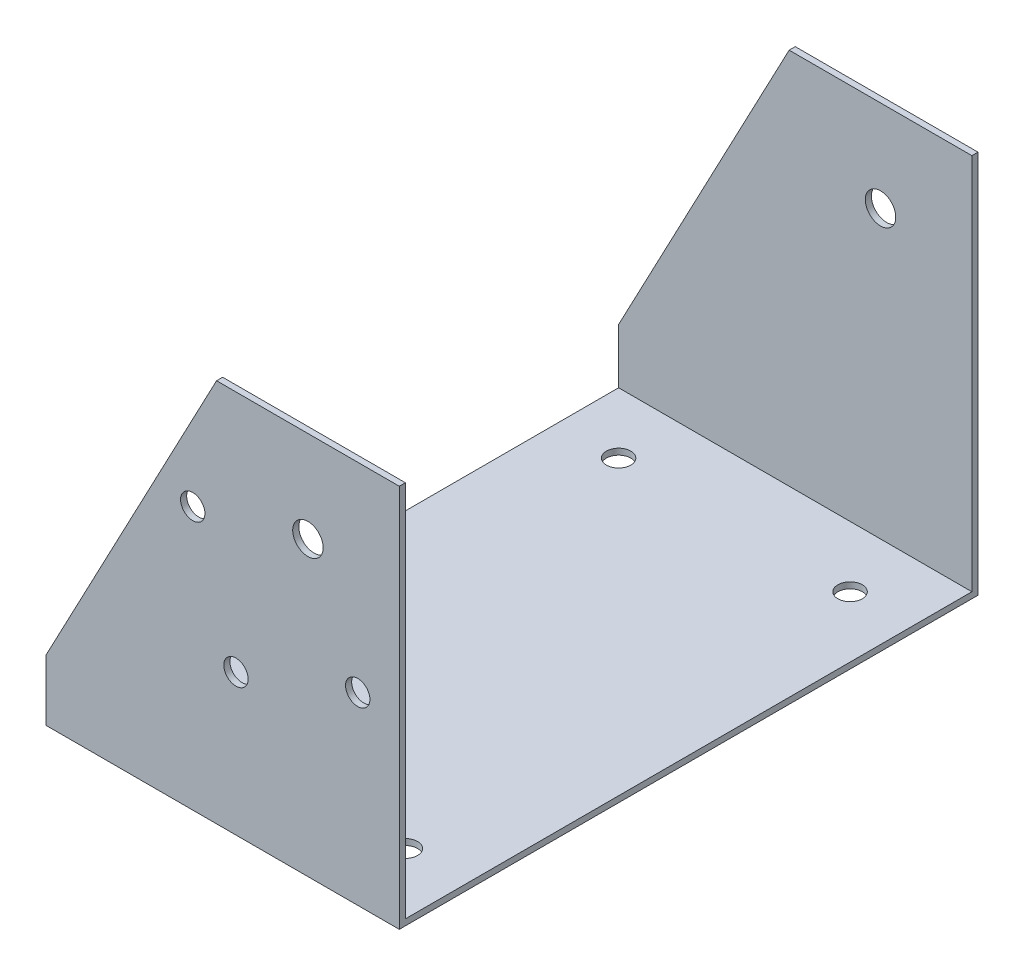
ISO-10303-21;
HEADER;
FILE_DESCRIPTION(('STEP AP214'),'2;1');
FILE_NAME('part.step','',(''),(''),'','','');
FILE_SCHEMA(('AUTOMOTIVE_DESIGN { 1 0 10303 214 1 1 1 1 }'));
ENDSEC;
DATA;
#1=APPLICATION_CONTEXT('core data for automotive mechanical design processes');
#2=APPLICATION_PROTOCOL_DEFINITION('international standard','automotive_design',2000,#1);
#3=PRODUCT_CONTEXT('',#1,'mechanical');
#4=PRODUCT('Part','Part','',(#3));
#5=PRODUCT_RELATED_PRODUCT_CATEGORY('part','',(#4));
#6=PRODUCT_DEFINITION_FORMATION('','',#4);
#7=PRODUCT_DEFINITION_CONTEXT('part definition',#1,'design');
#8=PRODUCT_DEFINITION('design','',#6,#7);
#9=PRODUCT_DEFINITION_SHAPE('','',#8);
#10=(LENGTH_UNIT() NAMED_UNIT(*) SI_UNIT(.MILLI.,.METRE.));
#11=(NAMED_UNIT(*) PLANE_ANGLE_UNIT() SI_UNIT($,.RADIAN.));
#12=(NAMED_UNIT(*) SI_UNIT($,.STERADIAN.) SOLID_ANGLE_UNIT());
#13=UNCERTAINTY_MEASURE_WITH_UNIT(LENGTH_MEASURE(1.E-05),#10,'distance_accuracy_value','');
#14=(GEOMETRIC_REPRESENTATION_CONTEXT(3) GLOBAL_UNCERTAINTY_ASSIGNED_CONTEXT((#13)) GLOBAL_UNIT_ASSIGNED_CONTEXT((#10,
#11,#12)) REPRESENTATION_CONTEXT('',''));
#15=CARTESIAN_POINT('',(0.,0.,0.));
#16=DIRECTION('',(0.,0.,1.));
#17=DIRECTION('',(1.,0.,0.));
#18=AXIS2_PLACEMENT_3D('',#15,#16,#17);
#19=CARTESIAN_POINT('',(0.,1.,0.));
#20=DIRECTION('',(0.,1.,0.));
#21=DIRECTION('',(0.,0.,1.));
#22=AXIS2_PLACEMENT_3D('',#19,#20,#21);
#23=PLANE('',#22);
#24=CARTESIAN_POINT('',(19.,1.,-36.5));
#25=DIRECTION('',(0.,1.,0.));
#26=DIRECTION('',(0.,0.,-1.));
#27=AXIS2_PLACEMENT_3D('',#24,#25,#26);
#28=CIRCLE('',#27,2.);
#29=CARTESIAN_POINT('',(19.,1.,-38.5));
#30=VERTEX_POINT('',#29);
#31=EDGE_CURVE('E261',#30,#30,#28,.T.);
#32=ORIENTED_EDGE('',*,*,#31,.F.);
#33=EDGE_LOOP('',(#32));
#34=FACE_BOUND('',#33,.T.);
#35=CARTESIAN_POINT('',(18.9999999999999,1.,36.5));
#36=DIRECTION('',(0.,1.,0.));
#37=DIRECTION('',(0.,0.,1.));
#38=AXIS2_PLACEMENT_3D('',#35,#36,#37);
#39=CIRCLE('',#38,2.);
#40=CARTESIAN_POINT('',(18.9999999999999,1.,38.5));
#41=VERTEX_POINT('',#40);
#42=EDGE_CURVE('E255',#41,#41,#39,.T.);
#43=ORIENTED_EDGE('',*,*,#42,.F.);
#44=EDGE_LOOP('',(#43));
#45=FACE_BOUND('',#44,.T.);
#46=CARTESIAN_POINT('',(-19.,1.,36.5));
#47=DIRECTION('',(0.,1.,0.));
#48=DIRECTION('',(0.,0.,-1.));
#49=AXIS2_PLACEMENT_3D('',#46,#47,#48);
#50=CIRCLE('',#49,2.);
#51=CARTESIAN_POINT('',(-19.,1.,34.5));
#52=VERTEX_POINT('',#51);
#53=EDGE_CURVE('E249',#52,#52,#50,.T.);
#54=ORIENTED_EDGE('',*,*,#53,.F.);
#55=EDGE_LOOP('',(#54));
#56=FACE_BOUND('',#55,.T.);
#57=CARTESIAN_POINT('',(-19.,1.,-36.5));
#58=DIRECTION('',(0.,1.,0.));
#59=DIRECTION('',(0.,0.,1.));
#60=AXIS2_PLACEMENT_3D('',#57,#58,#59);
#61=CIRCLE('',#60,2.);
#62=CARTESIAN_POINT('',(-19.,1.,-34.5));
#63=VERTEX_POINT('',#62);
#64=EDGE_CURVE('E243',#63,#63,#61,.T.);
#65=ORIENTED_EDGE('',*,*,#64,.F.);
#66=EDGE_LOOP('',(#65));
#67=FACE_BOUND('',#66,.T.);
#68=DIRECTION('',(0.,0.,-1.));
#69=VECTOR('',#68,1.);
#70=CARTESIAN_POINT('',(29.,1.,47.5));
#71=LINE('',#70,#69);
#72=CARTESIAN_POINT('',(29.,1.,46.5));
#73=VERTEX_POINT('',#72);
#74=CARTESIAN_POINT('',(29.,1.,-46.5));
#75=VERTEX_POINT('',#74);
#76=EDGE_CURVE('E147',#73,#75,#71,.T.);
#77=ORIENTED_EDGE('',*,*,#76,.T.);
#78=DIRECTION('',(-1.,0.,0.));
#79=VECTOR('',#78,1.);
#80=CARTESIAN_POINT('',(29.,1.,-46.5));
#81=LINE('',#80,#79);
#82=CARTESIAN_POINT('',(-29.,1.,-46.5));
#83=VERTEX_POINT('',#82);
#84=EDGE_CURVE('E191',#75,#83,#81,.T.);
#85=ORIENTED_EDGE('',*,*,#84,.T.);
#86=DIRECTION('',(0.,0.,1.));
#87=VECTOR('',#86,1.);
#88=CARTESIAN_POINT('',(-29.,1.,47.5));
#89=LINE('',#88,#87);
#90=CARTESIAN_POINT('',(-29.,1.,46.5));
#91=VERTEX_POINT('',#90);
#92=EDGE_CURVE('E145',#83,#91,#89,.T.);
#93=ORIENTED_EDGE('',*,*,#92,.T.);
#94=DIRECTION('',(1.,0.,0.));
#95=VECTOR('',#94,1.);
#96=CARTESIAN_POINT('',(-29.,1.,46.5));
#97=LINE('',#96,#95);
#98=EDGE_CURVE('E126',#91,#73,#97,.T.);
#99=ORIENTED_EDGE('',*,*,#98,.T.);
#100=EDGE_LOOP('',(#77,#85,#93,#99));
#101=FACE_BOUND('',#100,.T.);
#102=ADVANCED_FACE('F32',(#34,#45,#56,#67,#101),#23,.T.);
#103=CARTESIAN_POINT('',(-29.,1.,47.5));
#104=DIRECTION('',(1.,0.,0.));
#105=DIRECTION('',(0.,0.,-1.));
#106=AXIS2_PLACEMENT_3D('',#103,#104,#105);
#107=PLANE('',#106);
#108=DIRECTION('',(0.,-1.,0.));
#109=VECTOR('',#108,1.);
#110=CARTESIAN_POINT('',(-29.,1.,47.5));
#111=LINE('',#110,#109);
#112=CARTESIAN_POINT('',(-29.,10.,47.5));
#113=VERTEX_POINT('',#112);
#114=CARTESIAN_POINT('',(-29.,0.,47.5));
#115=VERTEX_POINT('',#114);
#116=EDGE_CURVE('E11',#113,#115,#111,.T.);
#117=ORIENTED_EDGE('',*,*,#116,.F.);
#118=DIRECTION('',(0.,0.,1.));
#119=VECTOR('',#118,1.);
#120=CARTESIAN_POINT('',(-29.,10.,46.5));
#121=LINE('',#120,#119);
#122=CARTESIAN_POINT('',(-29.,10.,46.5));
#123=VERTEX_POINT('',#122);
#124=EDGE_CURVE('E108',#123,#113,#121,.T.);
#125=ORIENTED_EDGE('',*,*,#124,.F.);
#126=DIRECTION('',(0.,-1.,0.));
#127=VECTOR('',#126,1.);
#128=CARTESIAN_POINT('',(-29.,63.,46.5));
#129=LINE('',#128,#127);
#130=EDGE_CURVE('E119',#123,#91,#129,.T.);
#131=ORIENTED_EDGE('',*,*,#130,.T.);
#132=ORIENTED_EDGE('',*,*,#92,.F.);
#133=DIRECTION('',(0.,1.,0.));
#134=VECTOR('',#133,1.);
#135=CARTESIAN_POINT('',(-29.,1.,-46.5));
#136=LINE('',#135,#134);
#137=CARTESIAN_POINT('',(-29.,10.,-46.5));
#138=VERTEX_POINT('',#137);
#139=EDGE_CURVE('E188',#83,#138,#136,.T.);
#140=ORIENTED_EDGE('',*,*,#139,.T.);
#141=DIRECTION('',(0.,0.,-1.));
#142=VECTOR('',#141,1.);
#143=CARTESIAN_POINT('',(-29.,10.,-46.5));
#144=LINE('',#143,#142);
#145=CARTESIAN_POINT('',(-29.,10.,-47.5));
#146=VERTEX_POINT('',#145);
#147=EDGE_CURVE('E55',#138,#146,#144,.T.);
#148=ORIENTED_EDGE('',*,*,#147,.T.);
#149=DIRECTION('',(0.,-1.,0.));
#150=VECTOR('',#149,1.);
#151=CARTESIAN_POINT('',(-29.,1.,-47.5));
#152=LINE('',#151,#150);
#153=CARTESIAN_POINT('',(-29.,0.,-47.5));
#154=VERTEX_POINT('',#153);
#155=EDGE_CURVE('E150',#146,#154,#152,.T.);
#156=ORIENTED_EDGE('',*,*,#155,.T.);
#157=DIRECTION('',(0.,0.,1.));
#158=VECTOR('',#157,1.);
#159=CARTESIAN_POINT('',(-29.,0.,47.5));
#160=LINE('',#159,#158);
#161=EDGE_CURVE('E144',#154,#115,#160,.T.);
#162=ORIENTED_EDGE('',*,*,#161,.T.);
#163=EDGE_LOOP('',(#117,#125,#131,#132,#140,#148,#156,#162));
#164=FACE_BOUND('',#163,.T.);
#165=ADVANCED_FACE('F34',(#164),#107,.F.);
#166=CARTESIAN_POINT('',(29.,1.,47.5));
#167=DIRECTION('',(0.,0.,-1.));
#168=DIRECTION('',(-1.,0.,0.));
#169=AXIS2_PLACEMENT_3D('',#166,#167,#168);
#170=PLANE('',#169);
#171=CARTESIAN_POINT('',(2.18494040292394,23.1674736138761,47.5));
#172=DIRECTION('',(0.,0.,1.));
#173=DIRECTION('',(1.,0.,0.));
#174=AXIS2_PLACEMENT_3D('',#171,#172,#173);
#175=CIRCLE('',#174,2.);
#176=CARTESIAN_POINT('',(4.18494040292395,23.1674736138761,47.5));
#177=VERTEX_POINT('',#176);
#178=EDGE_CURVE('E228',#177,#177,#175,.T.);
#179=ORIENTED_EDGE('',*,*,#178,.F.);
#180=EDGE_LOOP('',(#179));
#181=FACE_BOUND('',#180,.T.);
#182=CARTESIAN_POINT('',(22.1745327573967,30.2679100442658,47.5));
#183=DIRECTION('',(0.,0.,1.));
#184=DIRECTION('',(1.,0.,0.));
#185=AXIS2_PLACEMENT_3D('',#182,#183,#184);
#186=CIRCLE('',#185,2.);
#187=CARTESIAN_POINT('',(24.1745327573967,30.2679100442658,47.5));
#188=VERTEX_POINT('',#187);
#189=EDGE_CURVE('E234',#188,#188,#186,.T.);
#190=ORIENTED_EDGE('',*,*,#189,.F.);
#191=EDGE_LOOP('',(#190));
#192=FACE_BOUND('',#191,.T.);
#193=CARTESIAN_POINT('',(-4.91021848280897,43.1570659683488,47.5));
#194=DIRECTION('',(0.,0.,1.));
#195=DIRECTION('',(1.,0.,0.));
#196=AXIS2_PLACEMENT_3D('',#193,#194,#195);
#197=CIRCLE('',#196,2.);
#198=CARTESIAN_POINT('',(-2.91021848280897,43.1570659683488,47.5));
#199=VERTEX_POINT('',#198);
#200=EDGE_CURVE('E225',#199,#199,#197,.T.);
#201=ORIENTED_EDGE('',*,*,#200,.F.);
#202=EDGE_LOOP('',(#201));
#203=FACE_BOUND('',#202,.T.);
#204=CARTESIAN_POINT('',(14.,48.,47.5));
#205=DIRECTION('',(0.,0.,1.));
#206=DIRECTION('',(1.,0.,0.));
#207=AXIS2_PLACEMENT_3D('',#204,#205,#206);
#208=CIRCLE('',#207,2.5);
#209=CARTESIAN_POINT('',(16.5,48.,47.5));
#210=VERTEX_POINT('',#209);
#211=EDGE_CURVE('E213',#210,#210,#208,.T.);
#212=ORIENTED_EDGE('',*,*,#211,.F.);
#213=EDGE_LOOP('',(#212));
#214=FACE_BOUND('',#213,.T.);
#215=DIRECTION('',(-1.,0.,0.));
#216=VECTOR('',#215,1.);
#217=CARTESIAN_POINT('',(29.,63.,47.5));
#218=LINE('',#217,#216);
#219=CARTESIAN_POINT('',(29.,63.,47.5));
#220=VERTEX_POINT('',#219);
#221=CARTESIAN_POINT('',(-0.99999999999999,63.,47.5));
#222=VERTEX_POINT('',#221);
#223=EDGE_CURVE('E127',#220,#222,#218,.T.);
#224=ORIENTED_EDGE('',*,*,#223,.T.);
#225=DIRECTION('',(0.467121033095552,0.884193384073724,0.));
#226=VECTOR('',#225,1.);
#227=CARTESIAN_POINT('',(-0.99999999999999,63.,47.5));
#228=LINE('',#227,#226);
#229=EDGE_CURVE('E114',#113,#222,#228,.T.);
#230=ORIENTED_EDGE('',*,*,#229,.F.);
#231=ORIENTED_EDGE('',*,*,#116,.T.);
#232=DIRECTION('',(1.,0.,0.));
#233=VECTOR('',#232,1.);
#234=CARTESIAN_POINT('',(29.,0.,47.5));
#235=LINE('',#234,#233);
#236=CARTESIAN_POINT('',(29.,0.,47.5));
#237=VERTEX_POINT('',#236);
#238=EDGE_CURVE('E152',#115,#237,#235,.T.);
#239=ORIENTED_EDGE('',*,*,#238,.T.);
#240=DIRECTION('',(0.,-1.,0.));
#241=VECTOR('',#240,1.);
#242=CARTESIAN_POINT('',(29.,1.,47.5));
#243=LINE('',#242,#241);
#244=EDGE_CURVE('E40',#220,#237,#243,.T.);
#245=ORIENTED_EDGE('',*,*,#244,.F.);
#246=EDGE_LOOP('',(#224,#230,#231,#239,#245));
#247=FACE_BOUND('',#246,.T.);
#248=ADVANCED_FACE('F341',(#181,#192,#203,#214,#247),#170,.F.);
#249=CARTESIAN_POINT('',(29.,1.,47.5));
#250=DIRECTION('',(-1.,0.,0.));
#251=DIRECTION('',(0.,0.,1.));
#252=AXIS2_PLACEMENT_3D('',#249,#250,#251);
#253=PLANE('',#252);
#254=DIRECTION('',(0.,0.,-1.));
#255=VECTOR('',#254,1.);
#256=CARTESIAN_POINT('',(29.,0.,47.5));
#257=LINE('',#256,#255);
#258=CARTESIAN_POINT('',(29.,0.,-47.5));
#259=VERTEX_POINT('',#258);
#260=EDGE_CURVE('E154',#237,#259,#257,.T.);
#261=ORIENTED_EDGE('',*,*,#260,.T.);
#262=DIRECTION('',(0.,-1.,0.));
#263=VECTOR('',#262,1.);
#264=CARTESIAN_POINT('',(29.,1.,-47.5));
#265=LINE('',#264,#263);
#266=CARTESIAN_POINT('',(29.,63.,-47.5));
#267=VERTEX_POINT('',#266);
#268=EDGE_CURVE('E159',#267,#259,#265,.T.);
#269=ORIENTED_EDGE('',*,*,#268,.F.);
#270=DIRECTION('',(0.,0.,-1.));
#271=VECTOR('',#270,1.);
#272=CARTESIAN_POINT('',(29.,63.,-46.5));
#273=LINE('',#272,#271);
#274=CARTESIAN_POINT('',(29.,63.,-46.5));
#275=VERTEX_POINT('',#274);
#276=EDGE_CURVE('E132',#275,#267,#273,.T.);
#277=ORIENTED_EDGE('',*,*,#276,.F.);
#278=DIRECTION('',(0.,-1.,0.));
#279=VECTOR('',#278,1.);
#280=CARTESIAN_POINT('',(29.,63.,-46.5));
#281=LINE('',#280,#279);
#282=EDGE_CURVE('E194',#275,#75,#281,.T.);
#283=ORIENTED_EDGE('',*,*,#282,.T.);
#284=ORIENTED_EDGE('',*,*,#76,.F.);
#285=DIRECTION('',(0.,1.,0.));
#286=VECTOR('',#285,1.);
#287=CARTESIAN_POINT('',(29.,1.,46.5));
#288=LINE('',#287,#286);
#289=CARTESIAN_POINT('',(29.,63.,46.5));
#290=VERTEX_POINT('',#289);
#291=EDGE_CURVE('E129',#73,#290,#288,.T.);
#292=ORIENTED_EDGE('',*,*,#291,.T.);
#293=DIRECTION('',(0.,0.,1.));
#294=VECTOR('',#293,1.);
#295=CARTESIAN_POINT('',(29.,63.,46.5));
#296=LINE('',#295,#294);
#297=EDGE_CURVE('E140',#290,#220,#296,.T.);
#298=ORIENTED_EDGE('',*,*,#297,.T.);
#299=ORIENTED_EDGE('',*,*,#244,.T.);
#300=EDGE_LOOP('',(#261,#269,#277,#283,#284,#292,#298,#299));
#301=FACE_BOUND('',#300,.T.);
#302=ADVANCED_FACE('F164',(#301),#253,.F.);
#303=CARTESIAN_POINT('',(29.,1.,-47.5));
#304=DIRECTION('',(0.,0.,1.));
#305=DIRECTION('',(1.,0.,0.));
#306=AXIS2_PLACEMENT_3D('',#303,#304,#305);
#307=PLANE('',#306);
#308=CARTESIAN_POINT('',(14.,48.,-47.5));
#309=DIRECTION('',(0.,0.,-1.));
#310=DIRECTION('',(-1.,0.,0.));
#311=AXIS2_PLACEMENT_3D('',#308,#309,#310);
#312=CIRCLE('',#311,2.5);
#313=CARTESIAN_POINT('',(11.5,48.,-47.5));
#314=VERTEX_POINT('',#313);
#315=EDGE_CURVE('E219',#314,#314,#312,.T.);
#316=ORIENTED_EDGE('',*,*,#315,.F.);
#317=EDGE_LOOP('',(#316));
#318=FACE_BOUND('',#317,.T.);
#319=ORIENTED_EDGE('',*,*,#155,.F.);
#320=DIRECTION('',(-0.467121033095552,-0.884193384073724,0.));
#321=VECTOR('',#320,1.);
#322=CARTESIAN_POINT('',(-1.00000000000004,63.,-47.5));
#323=LINE('',#322,#321);
#324=CARTESIAN_POINT('',(-1.00000000000004,63.,-47.5));
#325=VERTEX_POINT('',#324);
#326=EDGE_CURVE('E201',#325,#146,#323,.T.);
#327=ORIENTED_EDGE('',*,*,#326,.F.);
#328=DIRECTION('',(1.,0.,0.));
#329=VECTOR('',#328,1.);
#330=CARTESIAN_POINT('',(-29.,63.,-47.5));
#331=LINE('',#330,#329);
#332=EDGE_CURVE('E178',#325,#267,#331,.T.);
#333=ORIENTED_EDGE('',*,*,#332,.T.);
#334=ORIENTED_EDGE('',*,*,#268,.T.);
#335=DIRECTION('',(-1.,0.,0.));
#336=VECTOR('',#335,1.);
#337=CARTESIAN_POINT('',(29.,0.,-47.5));
#338=LINE('',#337,#336);
#339=EDGE_CURVE('E148',#259,#154,#338,.T.);
#340=ORIENTED_EDGE('',*,*,#339,.T.);
#341=EDGE_LOOP('',(#319,#327,#333,#334,#340));
#342=FACE_BOUND('',#341,.T.);
#343=ADVANCED_FACE('F175',(#318,#342),#307,.F.);
#344=CARTESIAN_POINT('',(0.,0.,0.));
#345=DIRECTION('',(0.,1.,0.));
#346=DIRECTION('',(0.,0.,1.));
#347=AXIS2_PLACEMENT_3D('',#344,#345,#346);
#348=PLANE('',#347);
#349=CARTESIAN_POINT('',(19.,0.,-36.5));
#350=DIRECTION('',(0.,1.,0.));
#351=DIRECTION('',(0.,0.,-1.));
#352=AXIS2_PLACEMENT_3D('',#349,#350,#351);
#353=CIRCLE('',#352,2.);
#354=CARTESIAN_POINT('',(19.,0.,-38.5));
#355=VERTEX_POINT('',#354);
#356=EDGE_CURVE('E246',#355,#355,#353,.T.);
#357=ORIENTED_EDGE('',*,*,#356,.T.);
#358=EDGE_LOOP('',(#357));
#359=FACE_BOUND('',#358,.T.);
#360=CARTESIAN_POINT('',(18.9999999999999,0.,36.5));
#361=DIRECTION('',(0.,1.,0.));
#362=DIRECTION('',(0.,0.,1.));
#363=AXIS2_PLACEMENT_3D('',#360,#361,#362);
#364=CIRCLE('',#363,2.);
#365=CARTESIAN_POINT('',(18.9999999999999,0.,38.5));
#366=VERTEX_POINT('',#365);
#367=EDGE_CURVE('E258',#366,#366,#364,.T.);
#368=ORIENTED_EDGE('',*,*,#367,.T.);
#369=EDGE_LOOP('',(#368));
#370=FACE_BOUND('',#369,.T.);
#371=CARTESIAN_POINT('',(-19.,0.,36.5));
#372=DIRECTION('',(0.,1.,0.));
#373=DIRECTION('',(0.,0.,-1.));
#374=AXIS2_PLACEMENT_3D('',#371,#372,#373);
#375=CIRCLE('',#374,2.);
#376=CARTESIAN_POINT('',(-19.,0.,34.5));
#377=VERTEX_POINT('',#376);
#378=EDGE_CURVE('E252',#377,#377,#375,.T.);
#379=ORIENTED_EDGE('',*,*,#378,.T.);
#380=EDGE_LOOP('',(#379));
#381=FACE_BOUND('',#380,.T.);
#382=CARTESIAN_POINT('',(-19.,0.,-36.5));
#383=DIRECTION('',(0.,1.,0.));
#384=DIRECTION('',(0.,0.,1.));
#385=AXIS2_PLACEMENT_3D('',#382,#383,#384);
#386=CIRCLE('',#385,2.);
#387=CARTESIAN_POINT('',(-19.,0.,-34.5));
#388=VERTEX_POINT('',#387);
#389=EDGE_CURVE('E235',#388,#388,#386,.T.);
#390=ORIENTED_EDGE('',*,*,#389,.T.);
#391=EDGE_LOOP('',(#390));
#392=FACE_BOUND('',#391,.T.);
#393=ORIENTED_EDGE('',*,*,#161,.F.);
#394=ORIENTED_EDGE('',*,*,#339,.F.);
#395=ORIENTED_EDGE('',*,*,#260,.F.);
#396=ORIENTED_EDGE('',*,*,#238,.F.);
#397=EDGE_LOOP('',(#393,#394,#395,#396));
#398=FACE_BOUND('',#397,.T.);
#399=ADVANCED_FACE('F172',(#359,#370,#381,#392,#398),#348,.F.);
#400=CARTESIAN_POINT('',(29.,63.,46.5));
#401=DIRECTION('',(0.,1.,0.));
#402=DIRECTION('',(0.,0.,1.));
#403=AXIS2_PLACEMENT_3D('',#400,#401,#402);
#404=PLANE('',#403);
#405=DIRECTION('',(0.,0.,1.));
#406=VECTOR('',#405,1.);
#407=CARTESIAN_POINT('',(-0.99999999999999,63.,46.5));
#408=LINE('',#407,#406);
#409=CARTESIAN_POINT('',(-0.999999999999978,63.,46.5));
#410=VERTEX_POINT('',#409);
#411=EDGE_CURVE('E47',#410,#222,#408,.T.);
#412=ORIENTED_EDGE('',*,*,#411,.T.);
#413=ORIENTED_EDGE('',*,*,#223,.F.);
#414=ORIENTED_EDGE('',*,*,#297,.F.);
#415=DIRECTION('',(-1.,0.,0.));
#416=VECTOR('',#415,1.);
#417=CARTESIAN_POINT('',(29.,63.,46.5));
#418=LINE('',#417,#416);
#419=EDGE_CURVE('E139',#290,#410,#418,.T.);
#420=ORIENTED_EDGE('',*,*,#419,.T.);
#421=EDGE_LOOP('',(#412,#413,#414,#420));
#422=FACE_BOUND('',#421,.T.);
#423=ADVANCED_FACE('F330',(#422),#404,.T.);
#424=CARTESIAN_POINT('',(0.,0.,46.5));
#425=DIRECTION('',(0.,0.,1.));
#426=DIRECTION('',(1.,0.,0.));
#427=AXIS2_PLACEMENT_3D('',#424,#425,#426);
#428=PLANE('',#427);
#429=CARTESIAN_POINT('',(2.18494040292394,23.1674736138761,46.5));
#430=DIRECTION('',(0.,0.,1.));
#431=DIRECTION('',(1.,0.,0.));
#432=AXIS2_PLACEMENT_3D('',#429,#430,#431);
#433=CIRCLE('',#432,2.);
#434=CARTESIAN_POINT('',(4.18494040292395,23.1674736138761,46.5));
#435=VERTEX_POINT('',#434);
#436=EDGE_CURVE('E238',#435,#435,#433,.T.);
#437=ORIENTED_EDGE('',*,*,#436,.T.);
#438=EDGE_LOOP('',(#437));
#439=FACE_BOUND('',#438,.T.);
#440=CARTESIAN_POINT('',(22.1745327573967,30.2679100442658,46.5));
#441=DIRECTION('',(0.,0.,1.));
#442=DIRECTION('',(1.,0.,0.));
#443=AXIS2_PLACEMENT_3D('',#440,#441,#442);
#444=CIRCLE('',#443,2.);
#445=CARTESIAN_POINT('',(24.1745327573967,30.2679100442658,46.5));
#446=VERTEX_POINT('',#445);
#447=EDGE_CURVE('E231',#446,#446,#444,.T.);
#448=ORIENTED_EDGE('',*,*,#447,.T.);
#449=EDGE_LOOP('',(#448));
#450=FACE_BOUND('',#449,.T.);
#451=CARTESIAN_POINT('',(-4.91021848280897,43.1570659683488,46.5));
#452=DIRECTION('',(0.,0.,1.));
#453=DIRECTION('',(1.,0.,0.));
#454=AXIS2_PLACEMENT_3D('',#451,#452,#453);
#455=CIRCLE('',#454,2.);
#456=CARTESIAN_POINT('',(-2.91021848280897,43.1570659683488,46.5));
#457=VERTEX_POINT('',#456);
#458=EDGE_CURVE('E222',#457,#457,#455,.T.);
#459=ORIENTED_EDGE('',*,*,#458,.T.);
#460=EDGE_LOOP('',(#459));
#461=FACE_BOUND('',#460,.T.);
#462=CARTESIAN_POINT('',(14.,48.,46.5));
#463=DIRECTION('',(0.,0.,1.));
#464=DIRECTION('',(1.,0.,0.));
#465=AXIS2_PLACEMENT_3D('',#462,#463,#464);
#466=CIRCLE('',#465,2.5);
#467=CARTESIAN_POINT('',(16.5,48.,46.5));
#468=VERTEX_POINT('',#467);
#469=EDGE_CURVE('E211',#468,#468,#466,.T.);
#470=ORIENTED_EDGE('',*,*,#469,.T.);
#471=EDGE_LOOP('',(#470));
#472=FACE_BOUND('',#471,.T.);
#473=ORIENTED_EDGE('',*,*,#130,.F.);
#474=DIRECTION('',(0.467121033095552,0.884193384073724,0.));
#475=VECTOR('',#474,1.);
#476=CARTESIAN_POINT('',(-0.99999999999999,63.,46.5));
#477=LINE('',#476,#475);
#478=EDGE_CURVE('E105',#123,#410,#477,.T.);
#479=ORIENTED_EDGE('',*,*,#478,.T.);
#480=ORIENTED_EDGE('',*,*,#419,.F.);
#481=ORIENTED_EDGE('',*,*,#291,.F.);
#482=ORIENTED_EDGE('',*,*,#98,.F.);
#483=EDGE_LOOP('',(#473,#479,#480,#481,#482));
#484=FACE_BOUND('',#483,.T.);
#485=ADVANCED_FACE('F124',(#439,#450,#461,#472,#484),#428,.F.);
#486=CARTESIAN_POINT('',(-29.,63.,-46.5));
#487=DIRECTION('',(0.,1.,0.));
#488=DIRECTION('',(0.,0.,1.));
#489=AXIS2_PLACEMENT_3D('',#486,#487,#488);
#490=PLANE('',#489);
#491=DIRECTION('',(0.,0.,-1.));
#492=VECTOR('',#491,1.);
#493=CARTESIAN_POINT('',(-1.00000000000004,63.,-46.5));
#494=LINE('',#493,#492);
#495=CARTESIAN_POINT('',(-1.00000000000004,63.,-46.5));
#496=VERTEX_POINT('',#495);
#497=EDGE_CURVE('E196',#496,#325,#494,.T.);
#498=ORIENTED_EDGE('',*,*,#497,.F.);
#499=DIRECTION('',(1.,0.,0.));
#500=VECTOR('',#499,1.);
#501=CARTESIAN_POINT('',(-29.,63.,-46.5));
#502=LINE('',#501,#500);
#503=EDGE_CURVE('E187',#496,#275,#502,.T.);
#504=ORIENTED_EDGE('',*,*,#503,.T.);
#505=ORIENTED_EDGE('',*,*,#276,.T.);
#506=ORIENTED_EDGE('',*,*,#332,.F.);
#507=EDGE_LOOP('',(#498,#504,#505,#506));
#508=FACE_BOUND('',#507,.T.);
#509=ADVANCED_FACE('F185',(#508),#490,.T.);
#510=CARTESIAN_POINT('',(0.,0.,-46.5));
#511=DIRECTION('',(0.,0.,-1.));
#512=DIRECTION('',(-1.,0.,0.));
#513=AXIS2_PLACEMENT_3D('',#510,#511,#512);
#514=PLANE('',#513);
#515=CARTESIAN_POINT('',(14.,48.,-46.5));
#516=DIRECTION('',(0.,0.,-1.));
#517=DIRECTION('',(-1.,0.,0.));
#518=AXIS2_PLACEMENT_3D('',#515,#516,#517);
#519=CIRCLE('',#518,2.5);
#520=CARTESIAN_POINT('',(11.5,48.,-46.5));
#521=VERTEX_POINT('',#520);
#522=EDGE_CURVE('E216',#521,#521,#519,.T.);
#523=ORIENTED_EDGE('',*,*,#522,.T.);
#524=EDGE_LOOP('',(#523));
#525=FACE_BOUND('',#524,.T.);
#526=ORIENTED_EDGE('',*,*,#503,.F.);
#527=DIRECTION('',(-0.467121033095552,-0.884193384073724,0.));
#528=VECTOR('',#527,1.);
#529=CARTESIAN_POINT('',(-1.00000000000004,63.,-46.5));
#530=LINE('',#529,#528);
#531=EDGE_CURVE('E198',#496,#138,#530,.T.);
#532=ORIENTED_EDGE('',*,*,#531,.T.);
#533=ORIENTED_EDGE('',*,*,#139,.F.);
#534=ORIENTED_EDGE('',*,*,#84,.F.);
#535=ORIENTED_EDGE('',*,*,#282,.F.);
#536=EDGE_LOOP('',(#526,#532,#533,#534,#535));
#537=FACE_BOUND('',#536,.T.);
#538=ADVANCED_FACE('F208',(#525,#537),#514,.F.);
#539=CARTESIAN_POINT('',(-1.00000000000004,63.,-46.5));
#540=DIRECTION('',(0.884193384073724,-0.467121033095552,0.));
#541=DIRECTION('',(0.467121033095552,0.884193384073724,0.));
#542=AXIS2_PLACEMENT_3D('',#539,#540,#541);
#543=PLANE('',#542);
#544=ORIENTED_EDGE('',*,*,#326,.T.);
#545=ORIENTED_EDGE('',*,*,#147,.F.);
#546=ORIENTED_EDGE('',*,*,#531,.F.);
#547=ORIENTED_EDGE('',*,*,#497,.T.);
#548=EDGE_LOOP('',(#544,#545,#546,#547));
#549=FACE_BOUND('',#548,.T.);
#550=ADVANCED_FACE('F320',(#549),#543,.F.);
#551=CARTESIAN_POINT('',(-0.99999999999999,63.,46.5));
#552=DIRECTION('',(0.884193384073724,-0.467121033095552,0.));
#553=DIRECTION('',(0.467121033095552,0.884193384073724,0.));
#554=AXIS2_PLACEMENT_3D('',#551,#552,#553);
#555=PLANE('',#554);
#556=ORIENTED_EDGE('',*,*,#229,.T.);
#557=ORIENTED_EDGE('',*,*,#411,.F.);
#558=ORIENTED_EDGE('',*,*,#478,.F.);
#559=ORIENTED_EDGE('',*,*,#124,.T.);
#560=EDGE_LOOP('',(#556,#557,#558,#559));
#561=FACE_BOUND('',#560,.T.);
#562=ADVANCED_FACE('F107',(#561),#555,.F.);
#563=CARTESIAN_POINT('',(14.,48.,46.5));
#564=DIRECTION('',(0.,0.,1.));
#565=DIRECTION('',(1.,0.,0.));
#566=AXIS2_PLACEMENT_3D('',#563,#564,#565);
#567=CYLINDRICAL_SURFACE('',#566,2.5);
#568=ORIENTED_EDGE('',*,*,#469,.F.);
#569=EDGE_LOOP('',(#568));
#570=FACE_BOUND('',#569,.T.);
#571=ORIENTED_EDGE('',*,*,#211,.T.);
#572=EDGE_LOOP('',(#571));
#573=FACE_BOUND('',#572,.T.);
#574=ADVANCED_FACE('F313',(#570,#573),#567,.F.);
#575=CARTESIAN_POINT('',(14.,48.,-46.5));
#576=DIRECTION('',(0.,0.,-1.));
#577=DIRECTION('',(-1.,0.,0.));
#578=AXIS2_PLACEMENT_3D('',#575,#576,#577);
#579=CYLINDRICAL_SURFACE('',#578,2.5);
#580=ORIENTED_EDGE('',*,*,#522,.F.);
#581=EDGE_LOOP('',(#580));
#582=FACE_BOUND('',#581,.T.);
#583=ORIENTED_EDGE('',*,*,#315,.T.);
#584=EDGE_LOOP('',(#583));
#585=FACE_BOUND('',#584,.T.);
#586=ADVANCED_FACE('F309',(#582,#585),#579,.F.);
#587=CARTESIAN_POINT('',(-4.91021848280897,43.1570659683488,46.5));
#588=DIRECTION('',(0.,0.,1.));
#589=DIRECTION('',(1.,0.,0.));
#590=AXIS2_PLACEMENT_3D('',#587,#588,#589);
#591=CYLINDRICAL_SURFACE('',#590,2.);
#592=ORIENTED_EDGE('',*,*,#458,.F.);
#593=EDGE_LOOP('',(#592));
#594=FACE_BOUND('',#593,.T.);
#595=ORIENTED_EDGE('',*,*,#200,.T.);
#596=EDGE_LOOP('',(#595));
#597=FACE_BOUND('',#596,.T.);
#598=ADVANCED_FACE('F305',(#594,#597),#591,.F.);
#599=CARTESIAN_POINT('',(22.1745327573967,30.2679100442658,46.5));
#600=DIRECTION('',(0.,0.,1.));
#601=DIRECTION('',(1.,0.,0.));
#602=AXIS2_PLACEMENT_3D('',#599,#600,#601);
#603=CYLINDRICAL_SURFACE('',#602,2.);
#604=ORIENTED_EDGE('',*,*,#447,.F.);
#605=EDGE_LOOP('',(#604));
#606=FACE_BOUND('',#605,.T.);
#607=ORIENTED_EDGE('',*,*,#189,.T.);
#608=EDGE_LOOP('',(#607));
#609=FACE_BOUND('',#608,.T.);
#610=ADVANCED_FACE('F297',(#606,#609),#603,.F.);
#611=CARTESIAN_POINT('',(2.18494040292394,23.1674736138761,46.5));
#612=DIRECTION('',(0.,0.,1.));
#613=DIRECTION('',(1.,0.,0.));
#614=AXIS2_PLACEMENT_3D('',#611,#612,#613);
#615=CYLINDRICAL_SURFACE('',#614,2.);
#616=ORIENTED_EDGE('',*,*,#436,.F.);
#617=EDGE_LOOP('',(#616));
#618=FACE_BOUND('',#617,.T.);
#619=ORIENTED_EDGE('',*,*,#178,.T.);
#620=EDGE_LOOP('',(#619));
#621=FACE_BOUND('',#620,.T.);
#622=ADVANCED_FACE('F288',(#618,#621),#615,.F.);
#623=CARTESIAN_POINT('',(-19.,0.,-36.5));
#624=DIRECTION('',(0.,1.,0.));
#625=DIRECTION('',(0.,0.,1.));
#626=AXIS2_PLACEMENT_3D('',#623,#624,#625);
#627=CYLINDRICAL_SURFACE('',#626,2.);
#628=ORIENTED_EDGE('',*,*,#389,.F.);
#629=EDGE_LOOP('',(#628));
#630=FACE_BOUND('',#629,.T.);
#631=ORIENTED_EDGE('',*,*,#64,.T.);
#632=EDGE_LOOP('',(#631));
#633=FACE_BOUND('',#632,.T.);
#634=ADVANCED_FACE('F285',(#630,#633),#627,.F.);
#635=CARTESIAN_POINT('',(-19.,0.,36.5));
#636=DIRECTION('',(0.,1.,0.));
#637=DIRECTION('',(0.,0.,1.));
#638=AXIS2_PLACEMENT_3D('',#635,#636,#637);
#639=CYLINDRICAL_SURFACE('',#638,2.);
#640=ORIENTED_EDGE('',*,*,#378,.F.);
#641=EDGE_LOOP('',(#640));
#642=FACE_BOUND('',#641,.T.);
#643=ORIENTED_EDGE('',*,*,#53,.T.);
#644=EDGE_LOOP('',(#643));
#645=FACE_BOUND('',#644,.T.);
#646=ADVANCED_FACE('F287',(#642,#645),#639,.F.);
#647=CARTESIAN_POINT('',(18.9999999999999,0.,36.5));
#648=DIRECTION('',(0.,1.,0.));
#649=DIRECTION('',(0.,0.,1.));
#650=AXIS2_PLACEMENT_3D('',#647,#648,#649);
#651=CYLINDRICAL_SURFACE('',#650,2.);
#652=ORIENTED_EDGE('',*,*,#367,.F.);
#653=EDGE_LOOP('',(#652));
#654=FACE_BOUND('',#653,.T.);
#655=ORIENTED_EDGE('',*,*,#42,.T.);
#656=EDGE_LOOP('',(#655));
#657=FACE_BOUND('',#656,.T.);
#658=ADVANCED_FACE('F272',(#654,#657),#651,.F.);
#659=CARTESIAN_POINT('',(19.,0.,-36.5));
#660=DIRECTION('',(0.,1.,0.));
#661=DIRECTION('',(0.,0.,1.));
#662=AXIS2_PLACEMENT_3D('',#659,#660,#661);
#663=CYLINDRICAL_SURFACE('',#662,2.);
#664=ORIENTED_EDGE('',*,*,#356,.F.);
#665=EDGE_LOOP('',(#664));
#666=FACE_BOUND('',#665,.T.);
#667=ORIENTED_EDGE('',*,*,#31,.T.);
#668=EDGE_LOOP('',(#667));
#669=FACE_BOUND('',#668,.T.);
#670=ADVANCED_FACE('F269',(#666,#669),#663,.F.);
#671=CLOSED_SHELL('',(#102,#165,#248,#302,#343,#399,#423,#485,#509,#538,#550,#562,#574,#586,
#598,#610,#622,#634,#646,#658,#670));
#672=MANIFOLD_SOLID_BREP('B2',#671);
#673=ADVANCED_BREP_SHAPE_REPRESENTATION('',(#18,#672),#14);
#674=SHAPE_DEFINITION_REPRESENTATION(#9,#673);
ENDSEC;
END-ISO-10303-21;
